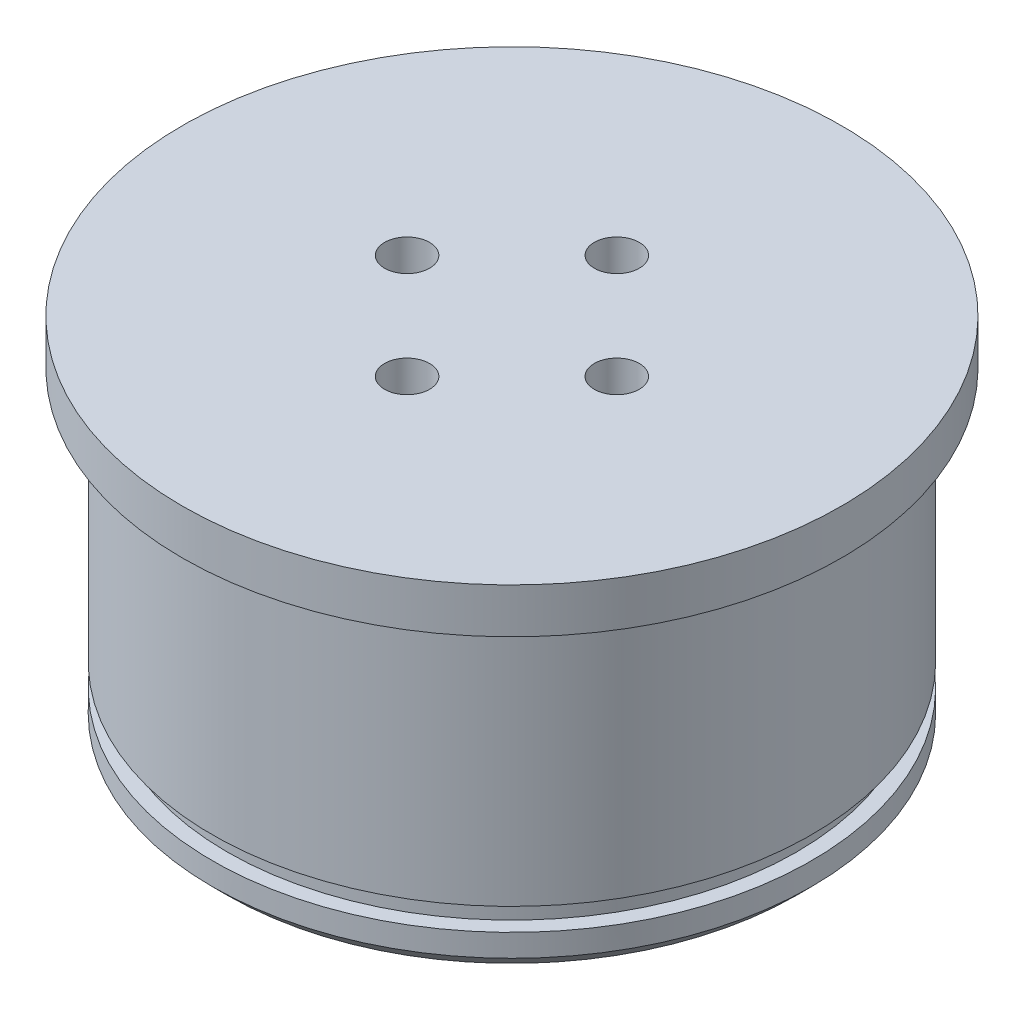
ISO-10303-21;
HEADER;
FILE_DESCRIPTION(('STEP AP214'),'2;1');
FILE_NAME('part.step','',(''),(''),'','','');
FILE_SCHEMA(('AUTOMOTIVE_DESIGN { 1 0 10303 214 1 1 1 1 }'));
ENDSEC;
DATA;
#1=APPLICATION_CONTEXT('core data for automotive mechanical design processes');
#2=APPLICATION_PROTOCOL_DEFINITION('international standard','automotive_design',2000,#1);
#3=PRODUCT_CONTEXT('',#1,'mechanical');
#4=PRODUCT('Part','Part','',(#3));
#5=PRODUCT_RELATED_PRODUCT_CATEGORY('part','',(#4));
#6=PRODUCT_DEFINITION_FORMATION('','',#4);
#7=PRODUCT_DEFINITION_CONTEXT('part definition',#1,'design');
#8=PRODUCT_DEFINITION('design','',#6,#7);
#9=PRODUCT_DEFINITION_SHAPE('','',#8);
#10=(LENGTH_UNIT() NAMED_UNIT(*) SI_UNIT(.MILLI.,.METRE.));
#11=(NAMED_UNIT(*) PLANE_ANGLE_UNIT() SI_UNIT($,.RADIAN.));
#12=(NAMED_UNIT(*) SI_UNIT($,.STERADIAN.) SOLID_ANGLE_UNIT());
#13=UNCERTAINTY_MEASURE_WITH_UNIT(LENGTH_MEASURE(1.E-05),#10,'distance_accuracy_value','');
#14=(GEOMETRIC_REPRESENTATION_CONTEXT(3) GLOBAL_UNCERTAINTY_ASSIGNED_CONTEXT((#13)) GLOBAL_UNIT_ASSIGNED_CONTEXT((#10,
#11,#12)) REPRESENTATION_CONTEXT('',''));
#15=CARTESIAN_POINT('',(0.,0.,0.));
#16=DIRECTION('',(0.,0.,1.));
#17=DIRECTION('',(1.,0.,0.));
#18=AXIS2_PLACEMENT_3D('',#15,#16,#17);
#19=CARTESIAN_POINT('',(0.,21.,0.));
#20=DIRECTION('',(0.,-1.,0.));
#21=DIRECTION('',(0.,0.,-1.));
#22=AXIS2_PLACEMENT_3D('',#19,#20,#21);
#23=CYLINDRICAL_SURFACE('',#22,20.);
#24=CARTESIAN_POINT('',(0.,1.00000000000003,0.));
#25=DIRECTION('',(0.,1.,0.));
#26=DIRECTION('',(0.,0.,1.));
#27=AXIS2_PLACEMENT_3D('',#24,#25,#26);
#28=CIRCLE('',#27,20.);
#29=CARTESIAN_POINT('',(0.,1.00000000000003,-20.));
#30=VERTEX_POINT('',#29);
#31=EDGE_CURVE('E40',#30,#30,#28,.T.);
#32=CARTESIAN_POINT('',(0.,2.5,0.));
#33=DIRECTION('',(0.,-1.,0.));
#34=DIRECTION('',(0.,0.,-1.));
#35=AXIS2_PLACEMENT_3D('',#32,#33,#34);
#36=CIRCLE('',#35,20.);
#37=CARTESIAN_POINT('',(0.,2.5,-20.));
#38=VERTEX_POINT('',#37);
#39=EDGE_CURVE('E57',#38,#38,#36,.T.);
#40=CARTESIAN_POINT('',(0.,1.00000000000003,-20.));
#41=CARTESIAN_POINT('',(0.,1.01562500000003,-20.));
#42=CARTESIAN_POINT('',(0.,1.03125000000003,-20.));
#43=CARTESIAN_POINT('',(0.,1.06250000000003,-20.));
#44=CARTESIAN_POINT('',(0.,1.07812500000003,-20.));
#45=CARTESIAN_POINT('',(0.,1.10937500000003,-20.));
#46=CARTESIAN_POINT('',(0.,1.12500000000003,-20.));
#47=CARTESIAN_POINT('',(0.,1.15625000000003,-20.));
#48=CARTESIAN_POINT('',(0.,1.17187500000003,-20.));
#49=CARTESIAN_POINT('',(0.,1.20312500000002,-20.));
#50=CARTESIAN_POINT('',(0.,1.21875000000002,-20.));
#51=CARTESIAN_POINT('',(0.,1.25000000000002,-20.));
#52=CARTESIAN_POINT('',(0.,1.26562500000002,-20.));
#53=CARTESIAN_POINT('',(0.,1.29687500000002,-20.));
#54=CARTESIAN_POINT('',(0.,1.31250000000002,-20.));
#55=CARTESIAN_POINT('',(0.,1.34375000000002,-20.));
#56=CARTESIAN_POINT('',(0.,1.35937500000002,-20.));
#57=CARTESIAN_POINT('',(0.,1.39062500000002,-20.));
#58=CARTESIAN_POINT('',(0.,1.40625000000002,-20.));
#59=CARTESIAN_POINT('',(0.,1.43750000000002,-20.));
#60=CARTESIAN_POINT('',(0.,1.45312500000002,-20.));
#61=CARTESIAN_POINT('',(0.,1.48437500000002,-20.));
#62=CARTESIAN_POINT('',(0.,1.50000000000002,-20.));
#63=CARTESIAN_POINT('',(0.,1.53125000000002,-20.));
#64=CARTESIAN_POINT('',(0.,1.54687500000002,-20.));
#65=CARTESIAN_POINT('',(0.,1.57812500000002,-20.));
#66=CARTESIAN_POINT('',(0.,1.59375000000002,-20.));
#67=CARTESIAN_POINT('',(0.,1.62500000000002,-20.));
#68=CARTESIAN_POINT('',(0.,1.64062500000002,-20.));
#69=CARTESIAN_POINT('',(0.,1.67187500000002,-20.));
#70=CARTESIAN_POINT('',(0.,1.68750000000002,-20.));
#71=CARTESIAN_POINT('',(0.,1.71875000000002,-20.));
#72=CARTESIAN_POINT('',(0.,1.73437500000002,-20.));
#73=CARTESIAN_POINT('',(0.,1.76562500000001,-20.));
#74=CARTESIAN_POINT('',(0.,1.78125000000001,-20.));
#75=CARTESIAN_POINT('',(0.,1.81250000000001,-20.));
#76=CARTESIAN_POINT('',(0.,1.82812500000001,-20.));
#77=CARTESIAN_POINT('',(0.,1.85937500000001,-20.));
#78=CARTESIAN_POINT('',(0.,1.87500000000001,-20.));
#79=CARTESIAN_POINT('',(0.,1.90625000000001,-20.));
#80=CARTESIAN_POINT('',(0.,1.92187500000001,-20.));
#81=CARTESIAN_POINT('',(0.,1.95312500000001,-20.));
#82=CARTESIAN_POINT('',(0.,1.96875000000001,-20.));
#83=CARTESIAN_POINT('',(0.,2.00000000000001,-20.));
#84=CARTESIAN_POINT('',(0.,2.01562500000001,-20.));
#85=CARTESIAN_POINT('',(0.,2.04687500000001,-20.));
#86=CARTESIAN_POINT('',(0.,2.06250000000001,-20.));
#87=CARTESIAN_POINT('',(0.,2.09375000000001,-20.));
#88=CARTESIAN_POINT('',(0.,2.10937500000001,-20.));
#89=CARTESIAN_POINT('',(0.,2.14062500000001,-20.));
#90=CARTESIAN_POINT('',(0.,2.15625000000001,-20.));
#91=CARTESIAN_POINT('',(0.,2.18750000000001,-20.));
#92=CARTESIAN_POINT('',(0.,2.20312500000001,-20.));
#93=CARTESIAN_POINT('',(0.,2.23437500000001,-20.));
#94=CARTESIAN_POINT('',(0.,2.25000000000001,-20.));
#95=CARTESIAN_POINT('',(0.,2.28125000000001,-20.));
#96=CARTESIAN_POINT('',(0.,2.29687500000001,-20.));
#97=CARTESIAN_POINT('',(0.,2.328125,-20.));
#98=CARTESIAN_POINT('',(0.,2.34375,-20.));
#99=CARTESIAN_POINT('',(0.,2.375,-20.));
#100=CARTESIAN_POINT('',(0.,2.39062500000001,-20.));
#101=CARTESIAN_POINT('',(0.,2.42187500000001,-20.));
#102=CARTESIAN_POINT('',(0.,2.4375,-20.));
#103=CARTESIAN_POINT('',(0.,2.46875,-20.));
#104=CARTESIAN_POINT('',(0.,2.484375,-20.));
#105=CARTESIAN_POINT('',(0.,2.5,-20.));
#106=B_SPLINE_CURVE_WITH_KNOTS('',3,(#40,#41,#42,#43,#44,#45,#46,#47,#48,#49,#50,#51,#52,#53,
#54,#55,#56,#57,#58,#59,#60,#61,#62,#63,#64,#65,#66,#67,#68,#69,#70,#71,#72,#73,#74,#75,#76,#77,
#78,#79,#80,#81,#82,#83,#84,#85,#86,#87,#88,#89,#90,#91,#92,#93,#94,#95,#96,#97,#98,#99,#100,
#101,#102,#103,#104,#105),.UNSPECIFIED.,.F.,.F.,(4,2,2,2,2,2,2,2,2,2,2,2,2,2,2,2,2,2,2,2,2,2,2,
2,2,2,2,2,2,2,2,2,4),(0.,0.0468749999999983,0.0937499999999966,0.140624999999998,
0.187499999999997,0.234374999999995,0.281249999999997,0.328124999999995,0.374999999999993,
0.421874999999992,0.46874999999999,0.515624999999992,0.56249999999999,0.609374999999988,
0.65624999999999,0.703124999999988,0.749999999999987,0.796874999999985,0.843749999999983,
0.890624999999985,0.937499999999983,0.984374999999982,1.03124999999998,1.07812499999998,
1.12499999999998,1.17187499999998,1.21874999999998,1.26562499999998,1.31249999999998,
1.35937499999998,1.40624999999998,1.45312499999998,1.49999999999997),.UNSPECIFIED.);
#107=EDGE_CURVE('BSEAM33',#30,#38,#106,.T.);
#108=ORIENTED_EDGE('',*,*,#31,.T.);
#109=ORIENTED_EDGE('',*,*,#39,.T.);
#110=ORIENTED_EDGE('',*,*,#107,.T.);
#111=ORIENTED_EDGE('',*,*,#107,.F.);
#112=EDGE_LOOP('',(#108,#110,#109,#111));
#113=FACE_BOUND('',#112,.T.);
#114=ADVANCED_FACE('F33',(#113),#23,.T.);
#115=CARTESIAN_POINT('',(0.,0.,0.));
#116=DIRECTION('',(0.,1.,0.));
#117=DIRECTION('',(0.,0.,1.));
#118=AXIS2_PLACEMENT_3D('',#115,#116,#117);
#119=PLANE('',#118);
#120=CARTESIAN_POINT('',(0.,0.,0.));
#121=DIRECTION('',(0.,1.,0.));
#122=DIRECTION('',(0.,0.,1.));
#123=AXIS2_PLACEMENT_3D('',#120,#121,#122);
#124=CIRCLE('',#123,19.);
#125=CARTESIAN_POINT('',(0.,0.,19.));
#126=VERTEX_POINT('',#125);
#127=EDGE_CURVE('E10',#126,#126,#124,.F.);
#128=ORIENTED_EDGE('',*,*,#127,.T.);
#129=EDGE_LOOP('',(#128));
#130=FACE_BOUND('',#129,.T.);
#131=CARTESIAN_POINT('',(0.,0.,0.));
#132=DIRECTION('',(0.,-1.,0.));
#133=DIRECTION('',(0.,0.,-1.));
#134=AXIS2_PLACEMENT_3D('',#131,#132,#133);
#135=CIRCLE('',#134,10.);
#136=CARTESIAN_POINT('',(0.,0.,-10.));
#137=VERTEX_POINT('',#136);
#138=EDGE_CURVE('E51',#137,#137,#135,.T.);
#139=ORIENTED_EDGE('',*,*,#138,.F.);
#140=EDGE_LOOP('',(#139));
#141=FACE_BOUND('',#140,.T.);
#142=ADVANCED_FACE('F125',(#130,#141),#119,.F.);
#143=CARTESIAN_POINT('',(0.,2.5,0.));
#144=DIRECTION('',(0.,-1.,0.));
#145=DIRECTION('',(0.,0.,-1.));
#146=AXIS2_PLACEMENT_3D('',#143,#144,#145);
#147=CYLINDRICAL_SURFACE('',#146,10.);
#148=CARTESIAN_POINT('',(0.,2.5,0.));
#149=DIRECTION('',(0.,-1.,0.));
#150=DIRECTION('',(0.,0.,-1.));
#151=AXIS2_PLACEMENT_3D('',#148,#149,#150);
#152=CIRCLE('',#151,10.);
#153=CARTESIAN_POINT('',(0.,2.5,-10.));
#154=VERTEX_POINT('',#153);
#155=EDGE_CURVE('E48',#154,#154,#152,.T.);
#156=ORIENTED_EDGE('',*,*,#155,.F.);
#157=EDGE_LOOP('',(#156));
#158=FACE_BOUND('',#157,.T.);
#159=ORIENTED_EDGE('',*,*,#138,.T.);
#160=EDGE_LOOP('',(#159));
#161=FACE_BOUND('',#160,.T.);
#162=ADVANCED_FACE('F113',(#158,#161),#147,.F.);
#163=CARTESIAN_POINT('',(0.,2.5,0.));
#164=DIRECTION('',(0.,-1.,0.));
#165=DIRECTION('',(0.,0.,-1.));
#166=AXIS2_PLACEMENT_3D('',#163,#164,#165);
#167=PLANE('',#166);
#168=CARTESIAN_POINT('',(7.,2.5,0.));
#169=DIRECTION('',(0.,-1.,0.));
#170=DIRECTION('',(-1.,0.,0.));
#171=AXIS2_PLACEMENT_3D('',#168,#169,#170);
#172=CIRCLE('',#171,1.5);
#173=CARTESIAN_POINT('',(5.5,2.5,0.));
#174=VERTEX_POINT('',#173);
#175=EDGE_CURVE('E93',#174,#174,#172,.T.);
#176=ORIENTED_EDGE('',*,*,#175,.F.);
#177=EDGE_LOOP('',(#176));
#178=FACE_BOUND('',#177,.T.);
#179=CARTESIAN_POINT('',(0.,2.5,-7.));
#180=DIRECTION('',(0.,-1.,0.));
#181=DIRECTION('',(0.,0.,1.));
#182=AXIS2_PLACEMENT_3D('',#179,#180,#181);
#183=CIRCLE('',#182,1.5);
#184=CARTESIAN_POINT('',(0.,2.5,-5.5));
#185=VERTEX_POINT('',#184);
#186=EDGE_CURVE('E87',#185,#185,#183,.T.);
#187=ORIENTED_EDGE('',*,*,#186,.F.);
#188=EDGE_LOOP('',(#187));
#189=FACE_BOUND('',#188,.T.);
#190=CARTESIAN_POINT('',(-7.,2.5,0.));
#191=DIRECTION('',(0.,-1.,0.));
#192=DIRECTION('',(1.,0.,0.));
#193=AXIS2_PLACEMENT_3D('',#190,#191,#192);
#194=CIRCLE('',#193,1.5);
#195=CARTESIAN_POINT('',(-5.5,2.5,0.));
#196=VERTEX_POINT('',#195);
#197=EDGE_CURVE('E81',#196,#196,#194,.T.);
#198=ORIENTED_EDGE('',*,*,#197,.F.);
#199=EDGE_LOOP('',(#198));
#200=FACE_BOUND('',#199,.T.);
#201=CARTESIAN_POINT('',(0.,2.5,7.));
#202=DIRECTION('',(0.,-1.,0.));
#203=DIRECTION('',(0.,0.,-1.));
#204=AXIS2_PLACEMENT_3D('',#201,#202,#203);
#205=CIRCLE('',#204,1.5);
#206=CARTESIAN_POINT('',(0.,2.5,5.5));
#207=VERTEX_POINT('',#206);
#208=EDGE_CURVE('E75',#207,#207,#205,.T.);
#209=ORIENTED_EDGE('',*,*,#208,.F.);
#210=EDGE_LOOP('',(#209));
#211=FACE_BOUND('',#210,.T.);
#212=ORIENTED_EDGE('',*,*,#155,.T.);
#213=EDGE_LOOP('',(#212));
#214=FACE_BOUND('',#213,.T.);
#215=ADVANCED_FACE('F109',(#178,#189,#200,#211,#214),#167,.T.);
#216=CARTESIAN_POINT('',(0.,4.,0.));
#217=DIRECTION('',(0.,-1.,0.));
#218=DIRECTION('',(0.,0.,-1.));
#219=AXIS2_PLACEMENT_3D('',#216,#217,#218);
#220=PLANE('',#219);
#221=CARTESIAN_POINT('',(0.,4.,0.));
#222=DIRECTION('',(0.,-1.,0.));
#223=DIRECTION('',(0.,0.,-1.));
#224=AXIS2_PLACEMENT_3D('',#221,#222,#223);
#225=CIRCLE('',#224,19.);
#226=CARTESIAN_POINT('',(0.,4.,-19.));
#227=VERTEX_POINT('',#226);
#228=EDGE_CURVE('E60',#227,#227,#225,.T.);
#229=ORIENTED_EDGE('',*,*,#228,.F.);
#230=EDGE_LOOP('',(#229));
#231=FACE_BOUND('',#230,.T.);
#232=CARTESIAN_POINT('',(0.,4.,0.));
#233=DIRECTION('',(0.,-1.,0.));
#234=DIRECTION('',(0.,0.,-1.));
#235=AXIS2_PLACEMENT_3D('',#232,#233,#234);
#236=CIRCLE('',#235,20.);
#237=CARTESIAN_POINT('',(0.,4.,-20.));
#238=VERTEX_POINT('',#237);
#239=EDGE_CURVE('E54',#238,#238,#236,.T.);
#240=ORIENTED_EDGE('',*,*,#239,.T.);
#241=EDGE_LOOP('',(#240));
#242=FACE_BOUND('',#241,.T.);
#243=ADVANCED_FACE('F112',(#231,#242),#220,.T.);
#244=CARTESIAN_POINT('',(0.,2.5,0.));
#245=DIRECTION('',(0.,-1.,0.));
#246=DIRECTION('',(0.,0.,-1.));
#247=AXIS2_PLACEMENT_3D('',#244,#245,#246);
#248=PLANE('',#247);
#249=CARTESIAN_POINT('',(0.,2.5,0.));
#250=DIRECTION('',(0.,-1.,0.));
#251=DIRECTION('',(0.,0.,-1.));
#252=AXIS2_PLACEMENT_3D('',#249,#250,#251);
#253=CIRCLE('',#252,19.);
#254=CARTESIAN_POINT('',(0.,2.5,-19.));
#255=VERTEX_POINT('',#254);
#256=EDGE_CURVE('E63',#255,#255,#253,.T.);
#257=ORIENTED_EDGE('',*,*,#256,.T.);
#258=EDGE_LOOP('',(#257));
#259=FACE_BOUND('',#258,.T.);
#260=ORIENTED_EDGE('',*,*,#39,.F.);
#261=EDGE_LOOP('',(#260));
#262=FACE_BOUND('',#261,.T.);
#263=ADVANCED_FACE('F136',(#259,#262),#248,.F.);
#264=CARTESIAN_POINT('',(0.,4.,0.));
#265=DIRECTION('',(0.,-1.,0.));
#266=DIRECTION('',(0.,0.,-1.));
#267=AXIS2_PLACEMENT_3D('',#264,#265,#266);
#268=CYLINDRICAL_SURFACE('',#267,19.);
#269=ORIENTED_EDGE('',*,*,#228,.T.);
#270=EDGE_LOOP('',(#269));
#271=FACE_BOUND('',#270,.T.);
#272=ORIENTED_EDGE('',*,*,#256,.F.);
#273=EDGE_LOOP('',(#272));
#274=FACE_BOUND('',#273,.T.);
#275=ADVANCED_FACE('F139',(#271,#274),#268,.T.);
#276=CARTESIAN_POINT('',(0.,21.,0.));
#277=DIRECTION('',(0.,1.,0.));
#278=DIRECTION('',(0.,0.,1.));
#279=AXIS2_PLACEMENT_3D('',#276,#277,#278);
#280=CIRCLE('',#279,20.);
#281=CARTESIAN_POINT('',(0.,21.,-20.));
#282=VERTEX_POINT('',#281);
#283=EDGE_CURVE('E44',#282,#282,#280,.T.);
#284=CARTESIAN_POINT('',(0.,21.,-20.));
#285=CARTESIAN_POINT('',(0.,20.8229166666667,-20.));
#286=CARTESIAN_POINT('',(0.,20.6458333333333,-20.));
#287=CARTESIAN_POINT('',(0.,20.2916666666667,-20.));
#288=CARTESIAN_POINT('',(0.,20.1145833333333,-20.));
#289=CARTESIAN_POINT('',(0.,19.7604166666667,-20.));
#290=CARTESIAN_POINT('',(0.,19.5833333333333,-20.));
#291=CARTESIAN_POINT('',(0.,19.2291666666667,-20.));
#292=CARTESIAN_POINT('',(0.,19.0520833333333,-20.));
#293=CARTESIAN_POINT('',(0.,18.6979166666667,-20.));
#294=CARTESIAN_POINT('',(0.,18.5208333333333,-20.));
#295=CARTESIAN_POINT('',(0.,18.1666666666667,-20.));
#296=CARTESIAN_POINT('',(0.,17.9895833333333,-20.));
#297=CARTESIAN_POINT('',(0.,17.6354166666667,-20.));
#298=CARTESIAN_POINT('',(0.,17.4583333333333,-20.));
#299=CARTESIAN_POINT('',(0.,17.1041666666667,-20.));
#300=CARTESIAN_POINT('',(0.,16.9270833333333,-20.));
#301=CARTESIAN_POINT('',(0.,16.5729166666667,-20.));
#302=CARTESIAN_POINT('',(0.,16.3958333333333,-20.));
#303=CARTESIAN_POINT('',(0.,16.0416666666667,-20.));
#304=CARTESIAN_POINT('',(0.,15.8645833333333,-20.));
#305=CARTESIAN_POINT('',(0.,15.5104166666667,-20.));
#306=CARTESIAN_POINT('',(0.,15.3333333333333,-20.));
#307=CARTESIAN_POINT('',(0.,14.9791666666667,-20.));
#308=CARTESIAN_POINT('',(0.,14.8020833333333,-20.));
#309=CARTESIAN_POINT('',(0.,14.4479166666667,-20.));
#310=CARTESIAN_POINT('',(0.,14.2708333333333,-20.));
#311=CARTESIAN_POINT('',(0.,13.9166666666667,-20.));
#312=CARTESIAN_POINT('',(0.,13.7395833333333,-20.));
#313=CARTESIAN_POINT('',(0.,13.3854166666667,-20.));
#314=CARTESIAN_POINT('',(0.,13.2083333333333,-20.));
#315=CARTESIAN_POINT('',(0.,12.8541666666667,-20.));
#316=CARTESIAN_POINT('',(0.,12.6770833333333,-20.));
#317=CARTESIAN_POINT('',(0.,12.3229166666667,-20.));
#318=CARTESIAN_POINT('',(0.,12.1458333333333,-20.));
#319=CARTESIAN_POINT('',(0.,11.7916666666667,-20.));
#320=CARTESIAN_POINT('',(0.,11.6145833333333,-20.));
#321=CARTESIAN_POINT('',(0.,11.2604166666667,-20.));
#322=CARTESIAN_POINT('',(0.,11.0833333333333,-20.));
#323=CARTESIAN_POINT('',(0.,10.7291666666667,-20.));
#324=CARTESIAN_POINT('',(0.,10.5520833333333,-20.));
#325=CARTESIAN_POINT('',(0.,10.1979166666667,-20.));
#326=CARTESIAN_POINT('',(0.,10.0208333333333,-20.));
#327=CARTESIAN_POINT('',(0.,9.66666666666667,-20.));
#328=CARTESIAN_POINT('',(0.,9.48958333333333,-20.));
#329=CARTESIAN_POINT('',(0.,9.13541666666667,-20.));
#330=CARTESIAN_POINT('',(0.,8.95833333333333,-20.));
#331=CARTESIAN_POINT('',(0.,8.60416666666667,-20.));
#332=CARTESIAN_POINT('',(0.,8.42708333333333,-20.));
#333=CARTESIAN_POINT('',(0.,8.07291666666667,-20.));
#334=CARTESIAN_POINT('',(0.,7.89583333333333,-20.));
#335=CARTESIAN_POINT('',(0.,7.54166666666667,-20.));
#336=CARTESIAN_POINT('',(0.,7.36458333333333,-20.));
#337=CARTESIAN_POINT('',(0.,7.01041666666667,-20.));
#338=CARTESIAN_POINT('',(0.,6.83333333333333,-20.));
#339=CARTESIAN_POINT('',(0.,6.47916666666667,-20.));
#340=CARTESIAN_POINT('',(0.,6.30208333333333,-20.));
#341=CARTESIAN_POINT('',(0.,5.94791666666667,-20.));
#342=CARTESIAN_POINT('',(0.,5.77083333333333,-20.));
#343=CARTESIAN_POINT('',(0.,5.41666666666667,-20.));
#344=CARTESIAN_POINT('',(0.,5.23958333333334,-20.));
#345=CARTESIAN_POINT('',(0.,4.88541666666667,-20.));
#346=CARTESIAN_POINT('',(0.,4.70833333333334,-20.));
#347=CARTESIAN_POINT('',(0.,4.35416666666667,-20.));
#348=CARTESIAN_POINT('',(0.,4.17708333333334,-20.));
#349=CARTESIAN_POINT('',(0.,4.,-20.));
#350=B_SPLINE_CURVE_WITH_KNOTS('',3,(#284,#285,#286,#287,#288,#289,#290,#291,#292,#293,#294,
#295,#296,#297,#298,#299,#300,#301,#302,#303,#304,#305,#306,#307,#308,#309,#310,#311,#312,#313,
#314,#315,#316,#317,#318,#319,#320,#321,#322,#323,#324,#325,#326,#327,#328,#329,#330,#331,#332,
#333,#334,#335,#336,#337,#338,#339,#340,#341,#342,#343,#344,#345,#346,#347,#348,#349),
.UNSPECIFIED.,.F.,.F.,(4,2,2,2,2,2,2,2,2,2,2,2,2,2,2,2,2,2,2,2,2,2,2,2,2,2,2,2,2,2,2,2,4),(0.,
0.53125,1.0625,1.59375,2.125,2.65625,3.1875,3.71875,4.25,4.78125,5.3125,5.84375,6.375,6.90625,
7.4375,7.96875,8.5,9.03125,9.5625,10.09375,10.625,11.15625,11.6875,12.21875,12.75,13.28125,
13.8125,14.34375,14.875,15.40625,15.9375,16.46875,17.),.UNSPECIFIED.);
#351=EDGE_CURVE('BSEAM134',#282,#238,#350,.T.);
#352=ORIENTED_EDGE('',*,*,#283,.F.);
#353=ORIENTED_EDGE('',*,*,#239,.F.);
#354=ORIENTED_EDGE('',*,*,#351,.T.);
#355=ORIENTED_EDGE('',*,*,#351,.F.);
#356=EDGE_LOOP('',(#352,#354,#353,#355));
#357=FACE_BOUND('',#356,.T.);
#358=ADVANCED_FACE('F134',(#357),#23,.T.);
#359=CARTESIAN_POINT('',(0.,1.00000000000003,0.));
#360=DIRECTION('',(0.,1.,0.));
#361=DIRECTION('',(0.,0.,1.));
#362=AXIS2_PLACEMENT_3D('',#359,#360,#361);
#363=CONICAL_SURFACE('',#362,20.,0.78539816339745);
#364=ORIENTED_EDGE('',*,*,#127,.F.);
#365=EDGE_LOOP('',(#364));
#366=FACE_BOUND('',#365,.T.);
#367=ORIENTED_EDGE('',*,*,#31,.F.);
#368=EDGE_LOOP('',(#367));
#369=FACE_BOUND('',#368,.T.);
#370=ADVANCED_FACE('F35',(#366,#369),#363,.T.);
#371=CARTESIAN_POINT('',(0.,24.,0.));
#372=DIRECTION('',(0.,-1.,0.));
#373=DIRECTION('',(0.,0.,-1.));
#374=AXIS2_PLACEMENT_3D('',#371,#372,#373);
#375=CYLINDRICAL_SURFACE('',#374,22.);
#376=CARTESIAN_POINT('',(0.,24.,0.));
#377=DIRECTION('',(0.,1.,0.));
#378=DIRECTION('',(0.,0.,1.));
#379=AXIS2_PLACEMENT_3D('',#376,#377,#378);
#380=CIRCLE('',#379,22.);
#381=CARTESIAN_POINT('',(0.,24.,22.));
#382=VERTEX_POINT('',#381);
#383=EDGE_CURVE('E66',#382,#382,#380,.T.);
#384=ORIENTED_EDGE('',*,*,#383,.F.);
#385=EDGE_LOOP('',(#384));
#386=FACE_BOUND('',#385,.T.);
#387=CARTESIAN_POINT('',(0.,21.,0.));
#388=DIRECTION('',(0.,1.,0.));
#389=DIRECTION('',(0.,0.,1.));
#390=AXIS2_PLACEMENT_3D('',#387,#388,#389);
#391=CIRCLE('',#390,22.);
#392=CARTESIAN_POINT('',(0.,21.,22.));
#393=VERTEX_POINT('',#392);
#394=EDGE_CURVE('E69',#393,#393,#391,.T.);
#395=ORIENTED_EDGE('',*,*,#394,.T.);
#396=EDGE_LOOP('',(#395));
#397=FACE_BOUND('',#396,.T.);
#398=ADVANCED_FACE('F147',(#386,#397),#375,.T.);
#399=CARTESIAN_POINT('',(0.,24.,0.));
#400=DIRECTION('',(0.,1.,0.));
#401=DIRECTION('',(0.,0.,1.));
#402=AXIS2_PLACEMENT_3D('',#399,#400,#401);
#403=PLANE('',#402);
#404=CARTESIAN_POINT('',(7.,24.,0.));
#405=DIRECTION('',(0.,-1.,0.));
#406=DIRECTION('',(-1.,0.,0.));
#407=AXIS2_PLACEMENT_3D('',#404,#405,#406);
#408=CIRCLE('',#407,1.5);
#409=CARTESIAN_POINT('',(5.5,24.,0.));
#410=VERTEX_POINT('',#409);
#411=EDGE_CURVE('E78',#410,#410,#408,.T.);
#412=ORIENTED_EDGE('',*,*,#411,.T.);
#413=EDGE_LOOP('',(#412));
#414=FACE_BOUND('',#413,.T.);
#415=CARTESIAN_POINT('',(0.,24.,-7.));
#416=DIRECTION('',(0.,-1.,0.));
#417=DIRECTION('',(0.,0.,1.));
#418=AXIS2_PLACEMENT_3D('',#415,#416,#417);
#419=CIRCLE('',#418,1.5);
#420=CARTESIAN_POINT('',(0.,24.,-5.5));
#421=VERTEX_POINT('',#420);
#422=EDGE_CURVE('E90',#421,#421,#419,.T.);
#423=ORIENTED_EDGE('',*,*,#422,.T.);
#424=EDGE_LOOP('',(#423));
#425=FACE_BOUND('',#424,.T.);
#426=CARTESIAN_POINT('',(-7.,24.,0.));
#427=DIRECTION('',(0.,-1.,0.));
#428=DIRECTION('',(1.,0.,0.));
#429=AXIS2_PLACEMENT_3D('',#426,#427,#428);
#430=CIRCLE('',#429,1.5);
#431=CARTESIAN_POINT('',(-5.5,24.,0.));
#432=VERTEX_POINT('',#431);
#433=EDGE_CURVE('E84',#432,#432,#430,.T.);
#434=ORIENTED_EDGE('',*,*,#433,.T.);
#435=EDGE_LOOP('',(#434));
#436=FACE_BOUND('',#435,.T.);
#437=CARTESIAN_POINT('',(0.,24.,7.));
#438=DIRECTION('',(0.,-1.,0.));
#439=DIRECTION('',(0.,0.,-1.));
#440=AXIS2_PLACEMENT_3D('',#437,#438,#439);
#441=CIRCLE('',#440,1.5);
#442=CARTESIAN_POINT('',(0.,24.,5.5));
#443=VERTEX_POINT('',#442);
#444=EDGE_CURVE('E72',#443,#443,#441,.T.);
#445=ORIENTED_EDGE('',*,*,#444,.T.);
#446=EDGE_LOOP('',(#445));
#447=FACE_BOUND('',#446,.T.);
#448=ORIENTED_EDGE('',*,*,#383,.T.);
#449=EDGE_LOOP('',(#448));
#450=FACE_BOUND('',#449,.T.);
#451=ADVANCED_FACE('F99',(#414,#425,#436,#447,#450),#403,.T.);
#452=CARTESIAN_POINT('',(0.,21.,0.));
#453=DIRECTION('',(0.,1.,0.));
#454=DIRECTION('',(0.,0.,1.));
#455=AXIS2_PLACEMENT_3D('',#452,#453,#454);
#456=PLANE('',#455);
#457=ORIENTED_EDGE('',*,*,#283,.T.);
#458=EDGE_LOOP('',(#457));
#459=FACE_BOUND('',#458,.T.);
#460=ORIENTED_EDGE('',*,*,#394,.F.);
#461=EDGE_LOOP('',(#460));
#462=FACE_BOUND('',#461,.T.);
#463=ADVANCED_FACE('F151',(#459,#462),#456,.F.);
#464=CARTESIAN_POINT('',(0.,24.,7.));
#465=DIRECTION('',(0.,-1.,0.));
#466=DIRECTION('',(0.,0.,-1.));
#467=AXIS2_PLACEMENT_3D('',#464,#465,#466);
#468=CYLINDRICAL_SURFACE('',#467,1.5);
#469=ORIENTED_EDGE('',*,*,#444,.F.);
#470=EDGE_LOOP('',(#469));
#471=FACE_BOUND('',#470,.T.);
#472=ORIENTED_EDGE('',*,*,#208,.T.);
#473=EDGE_LOOP('',(#472));
#474=FACE_BOUND('',#473,.T.);
#475=ADVANCED_FACE('F154',(#471,#474),#468,.F.);
#476=CARTESIAN_POINT('',(-7.,24.,0.));
#477=DIRECTION('',(0.,-1.,0.));
#478=DIRECTION('',(0.,0.,-1.));
#479=AXIS2_PLACEMENT_3D('',#476,#477,#478);
#480=CYLINDRICAL_SURFACE('',#479,1.5);
#481=ORIENTED_EDGE('',*,*,#433,.F.);
#482=EDGE_LOOP('',(#481));
#483=FACE_BOUND('',#482,.T.);
#484=ORIENTED_EDGE('',*,*,#197,.T.);
#485=EDGE_LOOP('',(#484));
#486=FACE_BOUND('',#485,.T.);
#487=ADVANCED_FACE('F160',(#483,#486),#480,.F.);
#488=CARTESIAN_POINT('',(0.,24.,-7.));
#489=DIRECTION('',(0.,-1.,0.));
#490=DIRECTION('',(0.,0.,-1.));
#491=AXIS2_PLACEMENT_3D('',#488,#489,#490);
#492=CYLINDRICAL_SURFACE('',#491,1.5);
#493=ORIENTED_EDGE('',*,*,#422,.F.);
#494=EDGE_LOOP('',(#493));
#495=FACE_BOUND('',#494,.T.);
#496=ORIENTED_EDGE('',*,*,#186,.T.);
#497=EDGE_LOOP('',(#496));
#498=FACE_BOUND('',#497,.T.);
#499=ADVANCED_FACE('F105',(#495,#498),#492,.F.);
#500=CARTESIAN_POINT('',(7.,24.,0.));
#501=DIRECTION('',(0.,-1.,0.));
#502=DIRECTION('',(0.,0.,-1.));
#503=AXIS2_PLACEMENT_3D('',#500,#501,#502);
#504=CYLINDRICAL_SURFACE('',#503,1.5);
#505=ORIENTED_EDGE('',*,*,#411,.F.);
#506=EDGE_LOOP('',(#505));
#507=FACE_BOUND('',#506,.T.);
#508=ORIENTED_EDGE('',*,*,#175,.T.);
#509=EDGE_LOOP('',(#508));
#510=FACE_BOUND('',#509,.T.);
#511=ADVANCED_FACE('F102',(#507,#510),#504,.F.);
#512=CLOSED_SHELL('',(#114,#142,#162,#215,#243,#263,#275,#358,#370,#398,#451,#463,#475,#487,
#499,#511));
#513=MANIFOLD_SOLID_BREP('B2',#512);
#514=ADVANCED_BREP_SHAPE_REPRESENTATION('',(#18,#513),#14);
#515=SHAPE_DEFINITION_REPRESENTATION(#9,#514);
ENDSEC;
END-ISO-10303-21;
